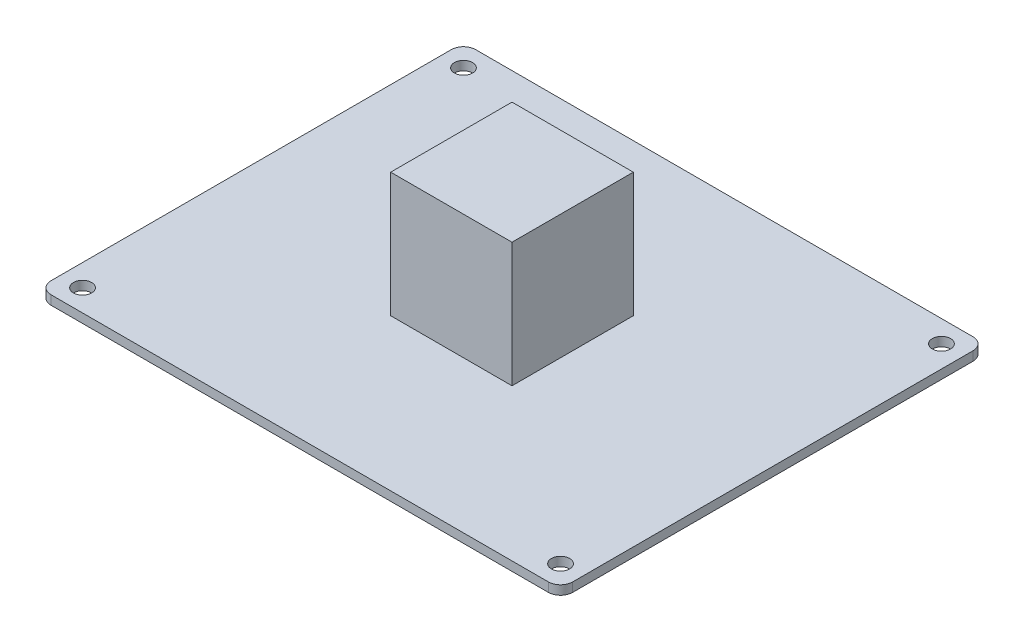
ISO-10303-21;
HEADER;
FILE_DESCRIPTION(('STEP AP214'),'2;1');
FILE_NAME('part.step','',(''),(''),'','','');
FILE_SCHEMA(('AUTOMOTIVE_DESIGN { 1 0 10303 214 1 1 1 1 }'));
ENDSEC;
DATA;
#1=APPLICATION_CONTEXT('core data for automotive mechanical design processes');
#2=APPLICATION_PROTOCOL_DEFINITION('international standard','automotive_design',2000,#1);
#3=PRODUCT_CONTEXT('',#1,'mechanical');
#4=PRODUCT('Part','Part','',(#3));
#5=PRODUCT_RELATED_PRODUCT_CATEGORY('part','',(#4));
#6=PRODUCT_DEFINITION_FORMATION('','',#4);
#7=PRODUCT_DEFINITION_CONTEXT('part definition',#1,'design');
#8=PRODUCT_DEFINITION('design','',#6,#7);
#9=PRODUCT_DEFINITION_SHAPE('','',#8);
#10=(LENGTH_UNIT() NAMED_UNIT(*) SI_UNIT(.MILLI.,.METRE.));
#11=(NAMED_UNIT(*) PLANE_ANGLE_UNIT() SI_UNIT($,.RADIAN.));
#12=(NAMED_UNIT(*) SI_UNIT($,.STERADIAN.) SOLID_ANGLE_UNIT());
#13=UNCERTAINTY_MEASURE_WITH_UNIT(LENGTH_MEASURE(1.E-05),#10,'distance_accuracy_value','');
#14=(GEOMETRIC_REPRESENTATION_CONTEXT(3) GLOBAL_UNCERTAINTY_ASSIGNED_CONTEXT((#13)) GLOBAL_UNIT_ASSIGNED_CONTEXT((#10,
#11,#12)) REPRESENTATION_CONTEXT('',''));
#15=CARTESIAN_POINT('',(0.,0.,0.));
#16=DIRECTION('',(0.,0.,1.));
#17=DIRECTION('',(1.,0.,0.));
#18=AXIS2_PLACEMENT_3D('',#15,#16,#17);
#19=CARTESIAN_POINT('',(43.,1.5,35.));
#20=DIRECTION('',(-1.,0.,0.));
#21=DIRECTION('',(0.,0.,1.));
#22=AXIS2_PLACEMENT_3D('',#19,#20,#21);
#23=PLANE('',#22);
#24=DIRECTION('',(0.,0.,-1.));
#25=VECTOR('',#24,1.);
#26=CARTESIAN_POINT('',(43.,0.,35.));
#27=LINE('',#26,#25);
#28=CARTESIAN_POINT('',(43.,0.,33.));
#29=VERTEX_POINT('',#28);
#30=CARTESIAN_POINT('',(43.,0.,-33.));
#31=VERTEX_POINT('',#30);
#32=EDGE_CURVE('E194',#29,#31,#27,.T.);
#33=ORIENTED_EDGE('',*,*,#32,.T.);
#34=DIRECTION('',(0.,-1.,0.));
#35=VECTOR('',#34,1.);
#36=CARTESIAN_POINT('',(43.,1.5,-33.));
#37=LINE('',#36,#35);
#38=CARTESIAN_POINT('',(43.,1.5,-33.));
#39=VERTEX_POINT('',#38);
#40=EDGE_CURVE('E11',#31,#39,#37,.F.);
#41=ORIENTED_EDGE('',*,*,#40,.T.);
#42=DIRECTION('',(0.,0.,-1.));
#43=VECTOR('',#42,1.);
#44=CARTESIAN_POINT('',(43.,1.5,35.));
#45=LINE('',#44,#43);
#46=CARTESIAN_POINT('',(43.,1.5,33.));
#47=VERTEX_POINT('',#46);
#48=EDGE_CURVE('E195',#47,#39,#45,.T.);
#49=ORIENTED_EDGE('',*,*,#48,.F.);
#50=DIRECTION('',(0.,-1.,0.));
#51=VECTOR('',#50,1.);
#52=CARTESIAN_POINT('',(43.,1.5,33.));
#53=LINE('',#52,#51);
#54=EDGE_CURVE('E54',#47,#29,#53,.T.);
#55=ORIENTED_EDGE('',*,*,#54,.T.);
#56=EDGE_LOOP('',(#33,#41,#49,#55));
#57=FACE_BOUND('',#56,.T.);
#58=ADVANCED_FACE('F45',(#57),#23,.F.);
#59=CARTESIAN_POINT('',(-43.,1.5,-35.));
#60=DIRECTION('',(0.,0.,1.));
#61=DIRECTION('',(1.,0.,0.));
#62=AXIS2_PLACEMENT_3D('',#59,#60,#61);
#63=PLANE('',#62);
#64=DIRECTION('',(-1.,0.,0.));
#65=VECTOR('',#64,1.);
#66=CARTESIAN_POINT('',(-43.,0.,-35.));
#67=LINE('',#66,#65);
#68=CARTESIAN_POINT('',(41.,0.,-35.));
#69=VERTEX_POINT('',#68);
#70=CARTESIAN_POINT('',(-41.,0.,-35.));
#71=VERTEX_POINT('',#70);
#72=EDGE_CURVE('E215',#69,#71,#67,.T.);
#73=ORIENTED_EDGE('',*,*,#72,.T.);
#74=DIRECTION('',(0.,-1.,0.));
#75=VECTOR('',#74,1.);
#76=CARTESIAN_POINT('',(-41.,1.5,-35.));
#77=LINE('',#76,#75);
#78=CARTESIAN_POINT('',(-41.,1.5,-35.));
#79=VERTEX_POINT('',#78);
#80=EDGE_CURVE('E69',#71,#79,#77,.F.);
#81=ORIENTED_EDGE('',*,*,#80,.T.);
#82=DIRECTION('',(-1.,0.,0.));
#83=VECTOR('',#82,1.);
#84=CARTESIAN_POINT('',(-43.,1.5,-35.));
#85=LINE('',#84,#83);
#86=CARTESIAN_POINT('',(41.,1.5,-35.));
#87=VERTEX_POINT('',#86);
#88=EDGE_CURVE('E199',#87,#79,#85,.T.);
#89=ORIENTED_EDGE('',*,*,#88,.F.);
#90=DIRECTION('',(0.,-1.,0.));
#91=VECTOR('',#90,1.);
#92=CARTESIAN_POINT('',(41.,1.5,-35.));
#93=LINE('',#92,#91);
#94=EDGE_CURVE('E262',#87,#69,#93,.T.);
#95=ORIENTED_EDGE('',*,*,#94,.T.);
#96=EDGE_LOOP('',(#73,#81,#89,#95));
#97=FACE_BOUND('',#96,.T.);
#98=ADVANCED_FACE('F284',(#97),#63,.F.);
#99=CARTESIAN_POINT('',(-43.,1.5,35.));
#100=DIRECTION('',(1.,0.,0.));
#101=DIRECTION('',(0.,0.,-1.));
#102=AXIS2_PLACEMENT_3D('',#99,#100,#101);
#103=PLANE('',#102);
#104=DIRECTION('',(0.,0.,1.));
#105=VECTOR('',#104,1.);
#106=CARTESIAN_POINT('',(-43.,0.,35.));
#107=LINE('',#106,#105);
#108=CARTESIAN_POINT('',(-43.,0.,-33.));
#109=VERTEX_POINT('',#108);
#110=CARTESIAN_POINT('',(-43.,0.,33.));
#111=VERTEX_POINT('',#110);
#112=EDGE_CURVE('E218',#109,#111,#107,.T.);
#113=ORIENTED_EDGE('',*,*,#112,.T.);
#114=DIRECTION('',(0.,-1.,0.));
#115=VECTOR('',#114,1.);
#116=CARTESIAN_POINT('',(-43.,1.5,33.));
#117=LINE('',#116,#115);
#118=CARTESIAN_POINT('',(-43.,1.5,33.));
#119=VERTEX_POINT('',#118);
#120=EDGE_CURVE('E247',#111,#119,#117,.F.);
#121=ORIENTED_EDGE('',*,*,#120,.T.);
#122=DIRECTION('',(0.,0.,1.));
#123=VECTOR('',#122,1.);
#124=CARTESIAN_POINT('',(-43.,1.5,35.));
#125=LINE('',#124,#123);
#126=CARTESIAN_POINT('',(-43.,1.5,-33.));
#127=VERTEX_POINT('',#126);
#128=EDGE_CURVE('E203',#127,#119,#125,.T.);
#129=ORIENTED_EDGE('',*,*,#128,.F.);
#130=DIRECTION('',(0.,-1.,0.));
#131=VECTOR('',#130,1.);
#132=CARTESIAN_POINT('',(-43.,1.5,-33.));
#133=LINE('',#132,#131);
#134=EDGE_CURVE('E243',#127,#109,#133,.T.);
#135=ORIENTED_EDGE('',*,*,#134,.T.);
#136=EDGE_LOOP('',(#113,#121,#129,#135));
#137=FACE_BOUND('',#136,.T.);
#138=ADVANCED_FACE('F294',(#137),#103,.F.);
#139=CARTESIAN_POINT('',(-43.,1.5,35.));
#140=DIRECTION('',(0.,0.,-1.));
#141=DIRECTION('',(-1.,0.,0.));
#142=AXIS2_PLACEMENT_3D('',#139,#140,#141);
#143=PLANE('',#142);
#144=DIRECTION('',(1.,0.,0.));
#145=VECTOR('',#144,1.);
#146=CARTESIAN_POINT('',(-43.,1.5,35.));
#147=LINE('',#146,#145);
#148=CARTESIAN_POINT('',(-41.,1.5,35.));
#149=VERTEX_POINT('',#148);
#150=CARTESIAN_POINT('',(41.,1.5,35.));
#151=VERTEX_POINT('',#150);
#152=EDGE_CURVE('E207',#149,#151,#147,.T.);
#153=ORIENTED_EDGE('',*,*,#152,.F.);
#154=DIRECTION('',(0.,-1.,0.));
#155=VECTOR('',#154,1.);
#156=CARTESIAN_POINT('',(-41.,1.5,35.));
#157=LINE('',#156,#155);
#158=CARTESIAN_POINT('',(-41.,0.,35.));
#159=VERTEX_POINT('',#158);
#160=EDGE_CURVE('E227',#149,#159,#157,.T.);
#161=ORIENTED_EDGE('',*,*,#160,.T.);
#162=DIRECTION('',(1.,0.,0.));
#163=VECTOR('',#162,1.);
#164=CARTESIAN_POINT('',(-43.,0.,35.));
#165=LINE('',#164,#163);
#166=CARTESIAN_POINT('',(41.,0.,35.));
#167=VERTEX_POINT('',#166);
#168=EDGE_CURVE('E200',#159,#167,#165,.T.);
#169=ORIENTED_EDGE('',*,*,#168,.T.);
#170=DIRECTION('',(0.,-1.,0.));
#171=VECTOR('',#170,1.);
#172=CARTESIAN_POINT('',(41.,1.5,35.));
#173=LINE('',#172,#171);
#174=EDGE_CURVE('E211',#167,#151,#173,.F.);
#175=ORIENTED_EDGE('',*,*,#174,.T.);
#176=EDGE_LOOP('',(#153,#161,#169,#175));
#177=FACE_BOUND('',#176,.T.);
#178=ADVANCED_FACE('F302',(#177),#143,.F.);
#179=CARTESIAN_POINT('',(0.,1.5,0.));
#180=DIRECTION('',(0.,-1.,0.));
#181=DIRECTION('',(0.,0.,-1.));
#182=AXIS2_PLACEMENT_3D('',#179,#180,#181);
#183=PLANE('',#182);
#184=CARTESIAN_POINT('',(-39.4,1.5,-31.4));
#185=DIRECTION('',(0.,1.,0.));
#186=DIRECTION('',(0.,0.,1.));
#187=AXIS2_PLACEMENT_3D('',#184,#185,#186);
#188=CIRCLE('',#187,1.49999999999999);
#189=CARTESIAN_POINT('',(-39.4,1.5,-29.9));
#190=VERTEX_POINT('',#189);
#191=EDGE_CURVE('E512',#190,#190,#188,.T.);
#192=ORIENTED_EDGE('',*,*,#191,.F.);
#193=EDGE_LOOP('',(#192));
#194=FACE_BOUND('',#193,.T.);
#195=CARTESIAN_POINT('',(39.4,1.5,-31.4));
#196=DIRECTION('',(0.,1.,0.));
#197=DIRECTION('',(0.,0.,1.));
#198=AXIS2_PLACEMENT_3D('',#195,#196,#197);
#199=CIRCLE('',#198,1.49999999999999);
#200=CARTESIAN_POINT('',(39.4,1.5,-29.9));
#201=VERTEX_POINT('',#200);
#202=EDGE_CURVE('E516',#201,#201,#199,.T.);
#203=ORIENTED_EDGE('',*,*,#202,.F.);
#204=EDGE_LOOP('',(#203));
#205=FACE_BOUND('',#204,.T.);
#206=CARTESIAN_POINT('',(-39.4,1.5,31.4));
#207=DIRECTION('',(0.,1.,0.));
#208=DIRECTION('',(0.,0.,1.));
#209=AXIS2_PLACEMENT_3D('',#206,#207,#208);
#210=CIRCLE('',#209,1.49999999999999);
#211=CARTESIAN_POINT('',(-39.4,1.5,32.9));
#212=VERTEX_POINT('',#211);
#213=EDGE_CURVE('E526',#212,#212,#210,.T.);
#214=ORIENTED_EDGE('',*,*,#213,.F.);
#215=EDGE_LOOP('',(#214));
#216=FACE_BOUND('',#215,.T.);
#217=CARTESIAN_POINT('',(39.4,1.5,31.4));
#218=DIRECTION('',(0.,1.,0.));
#219=DIRECTION('',(0.,0.,1.));
#220=AXIS2_PLACEMENT_3D('',#217,#218,#219);
#221=CIRCLE('',#220,1.49999999999999);
#222=CARTESIAN_POINT('',(39.4,1.5,32.9));
#223=VERTEX_POINT('',#222);
#224=EDGE_CURVE('E165',#223,#223,#221,.T.);
#225=ORIENTED_EDGE('',*,*,#224,.F.);
#226=EDGE_LOOP('',(#225));
#227=FACE_BOUND('',#226,.T.);
#228=DIRECTION('',(-1.,0.,0.));
#229=VECTOR('',#228,1.);
#230=CARTESIAN_POINT('',(0.,1.5,10.));
#231=LINE('',#230,#229);
#232=CARTESIAN_POINT('',(10.,1.5,10.));
#233=VERTEX_POINT('',#232);
#234=CARTESIAN_POINT('',(-10.,1.5,10.));
#235=VERTEX_POINT('',#234);
#236=EDGE_CURVE('E187',#233,#235,#231,.T.);
#237=ORIENTED_EDGE('',*,*,#236,.T.);
#238=DIRECTION('',(0.,0.,-1.));
#239=VECTOR('',#238,1.);
#240=CARTESIAN_POINT('',(-10.,1.5,0.));
#241=LINE('',#240,#239);
#242=CARTESIAN_POINT('',(-10.,1.5,-10.));
#243=VERTEX_POINT('',#242);
#244=EDGE_CURVE('E191',#235,#243,#241,.T.);
#245=ORIENTED_EDGE('',*,*,#244,.T.);
#246=DIRECTION('',(1.,0.,0.));
#247=VECTOR('',#246,1.);
#248=CARTESIAN_POINT('',(0.,1.5,-10.));
#249=LINE('',#248,#247);
#250=CARTESIAN_POINT('',(10.,1.5,-10.));
#251=VERTEX_POINT('',#250);
#252=EDGE_CURVE('E139',#243,#251,#249,.T.);
#253=ORIENTED_EDGE('',*,*,#252,.T.);
#254=DIRECTION('',(0.,0.,1.));
#255=VECTOR('',#254,1.);
#256=CARTESIAN_POINT('',(10.,1.5,0.));
#257=LINE('',#256,#255);
#258=EDGE_CURVE('E183',#251,#233,#257,.T.);
#259=ORIENTED_EDGE('',*,*,#258,.T.);
#260=EDGE_LOOP('',(#237,#245,#253,#259));
#261=FACE_BOUND('',#260,.T.);
#262=ORIENTED_EDGE('',*,*,#128,.T.);
#263=CARTESIAN_POINT('',(-41.,1.5,33.));
#264=DIRECTION('',(0.,-1.,0.));
#265=DIRECTION('',(0.,0.,-1.));
#266=AXIS2_PLACEMENT_3D('',#263,#264,#265);
#267=CIRCLE('',#266,2.);
#268=EDGE_CURVE('E259',#119,#149,#267,.F.);
#269=ORIENTED_EDGE('',*,*,#268,.T.);
#270=ORIENTED_EDGE('',*,*,#152,.T.);
#271=CARTESIAN_POINT('',(41.,1.5,33.));
#272=DIRECTION('',(0.,-1.,0.));
#273=DIRECTION('',(0.,0.,-1.));
#274=AXIS2_PLACEMENT_3D('',#271,#272,#273);
#275=CIRCLE('',#274,2.);
#276=EDGE_CURVE('E250',#151,#47,#275,.F.);
#277=ORIENTED_EDGE('',*,*,#276,.T.);
#278=ORIENTED_EDGE('',*,*,#48,.T.);
#279=CARTESIAN_POINT('',(41.,1.5,-33.));
#280=DIRECTION('',(0.,-1.,0.));
#281=DIRECTION('',(0.,0.,-1.));
#282=AXIS2_PLACEMENT_3D('',#279,#280,#281);
#283=CIRCLE('',#282,2.);
#284=EDGE_CURVE('E253',#39,#87,#283,.F.);
#285=ORIENTED_EDGE('',*,*,#284,.T.);
#286=ORIENTED_EDGE('',*,*,#88,.T.);
#287=CARTESIAN_POINT('',(-41.,1.5,-33.));
#288=DIRECTION('',(0.,-1.,0.));
#289=DIRECTION('',(0.,0.,-1.));
#290=AXIS2_PLACEMENT_3D('',#287,#288,#289);
#291=CIRCLE('',#290,2.);
#292=EDGE_CURVE('E256',#79,#127,#291,.F.);
#293=ORIENTED_EDGE('',*,*,#292,.T.);
#294=EDGE_LOOP('',(#262,#269,#270,#277,#278,#285,#286,#293));
#295=FACE_BOUND('',#294,.T.);
#296=ADVANCED_FACE('F287',(#194,#205,#216,#227,#261,#295),#183,.F.);
#297=CARTESIAN_POINT('',(0.,0.,0.));
#298=DIRECTION('',(0.,-1.,0.));
#299=DIRECTION('',(0.,0.,-1.));
#300=AXIS2_PLACEMENT_3D('',#297,#298,#299);
#301=PLANE('',#300);
#302=CARTESIAN_POINT('',(-39.4,0.,-31.4));
#303=DIRECTION('',(0.,1.,0.));
#304=DIRECTION('',(0.,0.,1.));
#305=AXIS2_PLACEMENT_3D('',#302,#303,#304);
#306=CIRCLE('',#305,1.5);
#307=CARTESIAN_POINT('',(-39.4,0.,-29.9));
#308=VERTEX_POINT('',#307);
#309=EDGE_CURVE('E509',#308,#308,#306,.T.);
#310=ORIENTED_EDGE('',*,*,#309,.T.);
#311=EDGE_LOOP('',(#310));
#312=FACE_BOUND('',#311,.T.);
#313=CARTESIAN_POINT('',(39.4,0.,-31.4));
#314=DIRECTION('',(0.,1.,0.));
#315=DIRECTION('',(0.,0.,1.));
#316=AXIS2_PLACEMENT_3D('',#313,#314,#315);
#317=CIRCLE('',#316,1.5);
#318=CARTESIAN_POINT('',(39.4,0.,-29.9));
#319=VERTEX_POINT('',#318);
#320=EDGE_CURVE('E522',#319,#319,#317,.T.);
#321=ORIENTED_EDGE('',*,*,#320,.T.);
#322=EDGE_LOOP('',(#321));
#323=FACE_BOUND('',#322,.T.);
#324=CARTESIAN_POINT('',(-39.4,0.,31.4));
#325=DIRECTION('',(0.,1.,0.));
#326=DIRECTION('',(0.,0.,1.));
#327=AXIS2_PLACEMENT_3D('',#324,#325,#326);
#328=CIRCLE('',#327,1.5);
#329=CARTESIAN_POINT('',(-39.4,0.,32.9));
#330=VERTEX_POINT('',#329);
#331=EDGE_CURVE('E530',#330,#330,#328,.T.);
#332=ORIENTED_EDGE('',*,*,#331,.T.);
#333=EDGE_LOOP('',(#332));
#334=FACE_BOUND('',#333,.T.);
#335=CARTESIAN_POINT('',(39.4,0.,31.4));
#336=DIRECTION('',(0.,1.,0.));
#337=DIRECTION('',(0.,0.,1.));
#338=AXIS2_PLACEMENT_3D('',#335,#336,#337);
#339=CIRCLE('',#338,1.5);
#340=CARTESIAN_POINT('',(39.4,0.,32.9));
#341=VERTEX_POINT('',#340);
#342=EDGE_CURVE('E161',#341,#341,#339,.T.);
#343=ORIENTED_EDGE('',*,*,#342,.T.);
#344=EDGE_LOOP('',(#343));
#345=FACE_BOUND('',#344,.T.);
#346=ORIENTED_EDGE('',*,*,#168,.F.);
#347=CARTESIAN_POINT('',(-41.,0.,33.));
#348=DIRECTION('',(0.,-1.,0.));
#349=DIRECTION('',(0.,0.,-1.));
#350=AXIS2_PLACEMENT_3D('',#347,#348,#349);
#351=CIRCLE('',#350,2.);
#352=EDGE_CURVE('E240',#159,#111,#351,.T.);
#353=ORIENTED_EDGE('',*,*,#352,.T.);
#354=ORIENTED_EDGE('',*,*,#112,.F.);
#355=CARTESIAN_POINT('',(-41.,0.,-33.));
#356=DIRECTION('',(0.,-1.,0.));
#357=DIRECTION('',(0.,0.,-1.));
#358=AXIS2_PLACEMENT_3D('',#355,#356,#357);
#359=CIRCLE('',#358,2.);
#360=EDGE_CURVE('E237',#109,#71,#359,.T.);
#361=ORIENTED_EDGE('',*,*,#360,.T.);
#362=ORIENTED_EDGE('',*,*,#72,.F.);
#363=CARTESIAN_POINT('',(41.,0.,-33.));
#364=DIRECTION('',(0.,-1.,0.));
#365=DIRECTION('',(0.,0.,-1.));
#366=AXIS2_PLACEMENT_3D('',#363,#364,#365);
#367=CIRCLE('',#366,2.);
#368=EDGE_CURVE('E234',#69,#31,#367,.T.);
#369=ORIENTED_EDGE('',*,*,#368,.T.);
#370=ORIENTED_EDGE('',*,*,#32,.F.);
#371=CARTESIAN_POINT('',(41.,0.,33.));
#372=DIRECTION('',(0.,-1.,0.));
#373=DIRECTION('',(0.,0.,-1.));
#374=AXIS2_PLACEMENT_3D('',#371,#372,#373);
#375=CIRCLE('',#374,2.);
#376=EDGE_CURVE('E231',#29,#167,#375,.T.);
#377=ORIENTED_EDGE('',*,*,#376,.T.);
#378=EDGE_LOOP('',(#346,#353,#354,#361,#362,#369,#370,#377));
#379=FACE_BOUND('',#378,.T.);
#380=ADVANCED_FACE('F278',(#312,#323,#334,#345,#379),#301,.T.);
#381=CARTESIAN_POINT('',(-41.,1.5,33.));
#382=DIRECTION('',(0.,-1.,0.));
#383=DIRECTION('',(0.,0.,-1.));
#384=AXIS2_PLACEMENT_3D('',#381,#382,#383);
#385=CYLINDRICAL_SURFACE('',#384,2.);
#386=ORIENTED_EDGE('',*,*,#268,.F.);
#387=ORIENTED_EDGE('',*,*,#120,.F.);
#388=ORIENTED_EDGE('',*,*,#352,.F.);
#389=ORIENTED_EDGE('',*,*,#160,.F.);
#390=EDGE_LOOP('',(#386,#387,#388,#389));
#391=FACE_BOUND('',#390,.T.);
#392=ADVANCED_FACE('F299',(#391),#385,.T.);
#393=CARTESIAN_POINT('',(-41.,1.5,-33.));
#394=DIRECTION('',(0.,-1.,0.));
#395=DIRECTION('',(0.,0.,-1.));
#396=AXIS2_PLACEMENT_3D('',#393,#394,#395);
#397=CYLINDRICAL_SURFACE('',#396,2.);
#398=ORIENTED_EDGE('',*,*,#292,.F.);
#399=ORIENTED_EDGE('',*,*,#80,.F.);
#400=ORIENTED_EDGE('',*,*,#360,.F.);
#401=ORIENTED_EDGE('',*,*,#134,.F.);
#402=EDGE_LOOP('',(#398,#399,#400,#401));
#403=FACE_BOUND('',#402,.T.);
#404=ADVANCED_FACE('F291',(#403),#397,.T.);
#405=CARTESIAN_POINT('',(41.,1.5,-33.));
#406=DIRECTION('',(0.,-1.,0.));
#407=DIRECTION('',(0.,0.,-1.));
#408=AXIS2_PLACEMENT_3D('',#405,#406,#407);
#409=CYLINDRICAL_SURFACE('',#408,2.);
#410=ORIENTED_EDGE('',*,*,#284,.F.);
#411=ORIENTED_EDGE('',*,*,#40,.F.);
#412=ORIENTED_EDGE('',*,*,#368,.F.);
#413=ORIENTED_EDGE('',*,*,#94,.F.);
#414=EDGE_LOOP('',(#410,#411,#412,#413));
#415=FACE_BOUND('',#414,.T.);
#416=ADVANCED_FACE('F283',(#415),#409,.T.);
#417=CARTESIAN_POINT('',(41.,1.5,33.));
#418=DIRECTION('',(0.,-1.,0.));
#419=DIRECTION('',(0.,0.,-1.));
#420=AXIS2_PLACEMENT_3D('',#417,#418,#419);
#421=CYLINDRICAL_SURFACE('',#420,2.);
#422=ORIENTED_EDGE('',*,*,#276,.F.);
#423=ORIENTED_EDGE('',*,*,#174,.F.);
#424=ORIENTED_EDGE('',*,*,#376,.F.);
#425=ORIENTED_EDGE('',*,*,#54,.F.);
#426=EDGE_LOOP('',(#422,#423,#424,#425));
#427=FACE_BOUND('',#426,.T.);
#428=ADVANCED_FACE('F47',(#427),#421,.T.);
#429=CARTESIAN_POINT('',(-10.,22.,-10.));
#430=DIRECTION('',(-1.,0.,0.));
#431=DIRECTION('',(0.,0.,1.));
#432=AXIS2_PLACEMENT_3D('',#429,#430,#431);
#433=PLANE('',#432);
#434=ORIENTED_EDGE('',*,*,#244,.F.);
#435=DIRECTION('',(0.,-1.,0.));
#436=VECTOR('',#435,1.);
#437=CARTESIAN_POINT('',(-10.,22.,10.));
#438=LINE('',#437,#436);
#439=CARTESIAN_POINT('',(-10.,22.,10.));
#440=VERTEX_POINT('',#439);
#441=EDGE_CURVE('E159',#440,#235,#438,.T.);
#442=ORIENTED_EDGE('',*,*,#441,.F.);
#443=DIRECTION('',(0.,0.,-1.));
#444=VECTOR('',#443,1.);
#445=CARTESIAN_POINT('',(-10.,22.,-10.));
#446=LINE('',#445,#444);
#447=CARTESIAN_POINT('',(-10.,22.,-10.));
#448=VERTEX_POINT('',#447);
#449=EDGE_CURVE('E151',#440,#448,#446,.T.);
#450=ORIENTED_EDGE('',*,*,#449,.T.);
#451=DIRECTION('',(0.,-1.,0.));
#452=VECTOR('',#451,1.);
#453=CARTESIAN_POINT('',(-10.,22.,-10.));
#454=LINE('',#453,#452);
#455=EDGE_CURVE('E134',#448,#243,#454,.T.);
#456=ORIENTED_EDGE('',*,*,#455,.T.);
#457=EDGE_LOOP('',(#434,#442,#450,#456));
#458=FACE_BOUND('',#457,.T.);
#459=ADVANCED_FACE('F157',(#458),#433,.T.);
#460=CARTESIAN_POINT('',(10.,22.,10.));
#461=DIRECTION('',(0.,0.,1.));
#462=DIRECTION('',(1.,0.,0.));
#463=AXIS2_PLACEMENT_3D('',#460,#461,#462);
#464=PLANE('',#463);
#465=ORIENTED_EDGE('',*,*,#236,.F.);
#466=DIRECTION('',(0.,-1.,0.));
#467=VECTOR('',#466,1.);
#468=CARTESIAN_POINT('',(10.,22.,10.));
#469=LINE('',#468,#467);
#470=CARTESIAN_POINT('',(10.,22.,10.));
#471=VERTEX_POINT('',#470);
#472=EDGE_CURVE('E175',#471,#233,#469,.T.);
#473=ORIENTED_EDGE('',*,*,#472,.F.);
#474=DIRECTION('',(-1.,0.,0.));
#475=VECTOR('',#474,1.);
#476=CARTESIAN_POINT('',(10.,22.,10.));
#477=LINE('',#476,#475);
#478=EDGE_CURVE('E144',#471,#440,#477,.T.);
#479=ORIENTED_EDGE('',*,*,#478,.T.);
#480=ORIENTED_EDGE('',*,*,#441,.T.);
#481=EDGE_LOOP('',(#465,#473,#479,#480));
#482=FACE_BOUND('',#481,.T.);
#483=ADVANCED_FACE('F309',(#482),#464,.T.);
#484=CARTESIAN_POINT('',(10.,22.,-10.));
#485=DIRECTION('',(1.,0.,0.));
#486=DIRECTION('',(0.,0.,-1.));
#487=AXIS2_PLACEMENT_3D('',#484,#485,#486);
#488=PLANE('',#487);
#489=ORIENTED_EDGE('',*,*,#258,.F.);
#490=DIRECTION('',(0.,-1.,0.));
#491=VECTOR('',#490,1.);
#492=CARTESIAN_POINT('',(10.,22.,-10.));
#493=LINE('',#492,#491);
#494=CARTESIAN_POINT('',(10.,22.,-10.));
#495=VERTEX_POINT('',#494);
#496=EDGE_CURVE('E61',#495,#251,#493,.T.);
#497=ORIENTED_EDGE('',*,*,#496,.F.);
#498=DIRECTION('',(0.,0.,1.));
#499=VECTOR('',#498,1.);
#500=CARTESIAN_POINT('',(10.,22.,-10.));
#501=LINE('',#500,#499);
#502=EDGE_CURVE('E154',#495,#471,#501,.T.);
#503=ORIENTED_EDGE('',*,*,#502,.T.);
#504=ORIENTED_EDGE('',*,*,#472,.T.);
#505=EDGE_LOOP('',(#489,#497,#503,#504));
#506=FACE_BOUND('',#505,.T.);
#507=ADVANCED_FACE('F353',(#506),#488,.T.);
#508=CARTESIAN_POINT('',(10.,22.,-10.));
#509=DIRECTION('',(0.,0.,-1.));
#510=DIRECTION('',(-1.,0.,0.));
#511=AXIS2_PLACEMENT_3D('',#508,#509,#510);
#512=PLANE('',#511);
#513=ORIENTED_EDGE('',*,*,#252,.F.);
#514=ORIENTED_EDGE('',*,*,#455,.F.);
#515=DIRECTION('',(1.,0.,0.));
#516=VECTOR('',#515,1.);
#517=CARTESIAN_POINT('',(10.,22.,-10.));
#518=LINE('',#517,#516);
#519=EDGE_CURVE('E137',#448,#495,#518,.T.);
#520=ORIENTED_EDGE('',*,*,#519,.T.);
#521=ORIENTED_EDGE('',*,*,#496,.T.);
#522=EDGE_LOOP('',(#513,#514,#520,#521));
#523=FACE_BOUND('',#522,.T.);
#524=ADVANCED_FACE('F136',(#523),#512,.T.);
#525=CARTESIAN_POINT('',(0.,22.,0.));
#526=DIRECTION('',(0.,-1.,0.));
#527=DIRECTION('',(0.,0.,-1.));
#528=AXIS2_PLACEMENT_3D('',#525,#526,#527);
#529=PLANE('',#528);
#530=ORIENTED_EDGE('',*,*,#449,.F.);
#531=ORIENTED_EDGE('',*,*,#478,.F.);
#532=ORIENTED_EDGE('',*,*,#502,.F.);
#533=ORIENTED_EDGE('',*,*,#519,.F.);
#534=EDGE_LOOP('',(#530,#531,#532,#533));
#535=FACE_BOUND('',#534,.T.);
#536=ADVANCED_FACE('F149',(#535),#529,.F.);
#537=CARTESIAN_POINT('',(39.4,1.5,31.4));
#538=DIRECTION('',(0.,1.,0.));
#539=DIRECTION('',(0.,0.,1.));
#540=AXIS2_PLACEMENT_3D('',#537,#538,#539);
#541=CYLINDRICAL_SURFACE('',#540,1.49999999999999);
#542=ORIENTED_EDGE('',*,*,#342,.F.);
#543=EDGE_LOOP('',(#542));
#544=FACE_BOUND('',#543,.T.);
#545=ORIENTED_EDGE('',*,*,#224,.T.);
#546=EDGE_LOOP('',(#545));
#547=FACE_BOUND('',#546,.T.);
#548=ADVANCED_FACE('F383',(#544,#547),#541,.F.);
#549=CARTESIAN_POINT('',(-39.4,1.5,31.4));
#550=DIRECTION('',(0.,1.,0.));
#551=DIRECTION('',(0.,0.,1.));
#552=AXIS2_PLACEMENT_3D('',#549,#550,#551);
#553=CYLINDRICAL_SURFACE('',#552,1.49999999999999);
#554=ORIENTED_EDGE('',*,*,#331,.F.);
#555=EDGE_LOOP('',(#554));
#556=FACE_BOUND('',#555,.T.);
#557=ORIENTED_EDGE('',*,*,#213,.T.);
#558=EDGE_LOOP('',(#557));
#559=FACE_BOUND('',#558,.T.);
#560=ADVANCED_FACE('F415',(#556,#559),#553,.F.);
#561=CARTESIAN_POINT('',(39.4,1.5,-31.4));
#562=DIRECTION('',(0.,1.,0.));
#563=DIRECTION('',(0.,0.,1.));
#564=AXIS2_PLACEMENT_3D('',#561,#562,#563);
#565=CYLINDRICAL_SURFACE('',#564,1.49999999999999);
#566=ORIENTED_EDGE('',*,*,#320,.F.);
#567=EDGE_LOOP('',(#566));
#568=FACE_BOUND('',#567,.T.);
#569=ORIENTED_EDGE('',*,*,#202,.T.);
#570=EDGE_LOOP('',(#569));
#571=FACE_BOUND('',#570,.T.);
#572=ADVANCED_FACE('F426',(#568,#571),#565,.F.);
#573=CARTESIAN_POINT('',(-39.4,1.5,-31.4));
#574=DIRECTION('',(0.,1.,0.));
#575=DIRECTION('',(0.,0.,1.));
#576=AXIS2_PLACEMENT_3D('',#573,#574,#575);
#577=CYLINDRICAL_SURFACE('',#576,1.49999999999999);
#578=ORIENTED_EDGE('',*,*,#309,.F.);
#579=EDGE_LOOP('',(#578));
#580=FACE_BOUND('',#579,.T.);
#581=ORIENTED_EDGE('',*,*,#191,.T.);
#582=EDGE_LOOP('',(#581));
#583=FACE_BOUND('',#582,.T.);
#584=ADVANCED_FACE('F437',(#580,#583),#577,.F.);
#585=CLOSED_SHELL('',(#58,#98,#138,#178,#296,#380,#392,#404,#416,#428,#459,#483,#507,#524,#536,
#548,#560,#572,#584));
#586=MANIFOLD_SOLID_BREP('B2',#585);
#587=ADVANCED_BREP_SHAPE_REPRESENTATION('',(#18,#586),#14);
#588=SHAPE_DEFINITION_REPRESENTATION(#9,#587);
ENDSEC;
END-ISO-10303-21;
